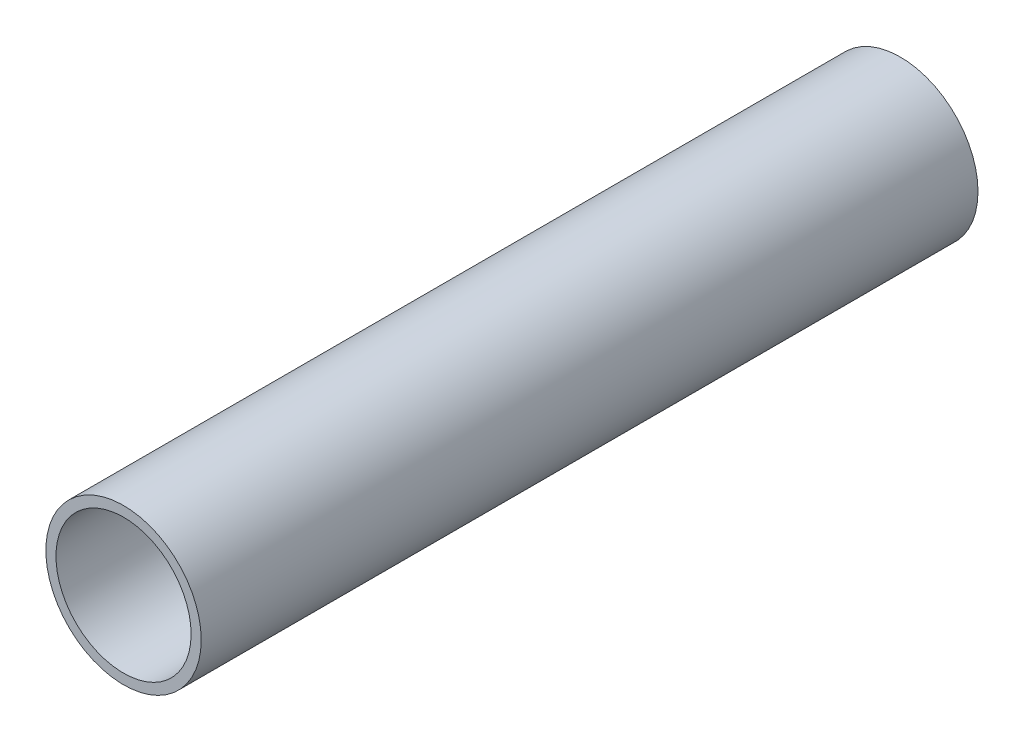
ISO-10303-21;
HEADER;
FILE_DESCRIPTION(('STEP AP214'),'2;1');
FILE_NAME('part.step','',(''),(''),'','','');
FILE_SCHEMA(('AUTOMOTIVE_DESIGN { 1 0 10303 214 1 1 1 1 }'));
ENDSEC;
DATA;
#1=APPLICATION_CONTEXT('core data for automotive mechanical design processes');
#2=APPLICATION_PROTOCOL_DEFINITION('international standard','automotive_design',2000,#1);
#3=PRODUCT_CONTEXT('',#1,'mechanical');
#4=PRODUCT('Part','Part','',(#3));
#5=PRODUCT_RELATED_PRODUCT_CATEGORY('part','',(#4));
#6=PRODUCT_DEFINITION_FORMATION('','',#4);
#7=PRODUCT_DEFINITION_CONTEXT('part definition',#1,'design');
#8=PRODUCT_DEFINITION('design','',#6,#7);
#9=PRODUCT_DEFINITION_SHAPE('','',#8);
#10=(LENGTH_UNIT() NAMED_UNIT(*) SI_UNIT(.MILLI.,.METRE.));
#11=(NAMED_UNIT(*) PLANE_ANGLE_UNIT() SI_UNIT($,.RADIAN.));
#12=(NAMED_UNIT(*) SI_UNIT($,.STERADIAN.) SOLID_ANGLE_UNIT());
#13=UNCERTAINTY_MEASURE_WITH_UNIT(LENGTH_MEASURE(1.E-05),#10,'distance_accuracy_value','');
#14=(GEOMETRIC_REPRESENTATION_CONTEXT(3) GLOBAL_UNCERTAINTY_ASSIGNED_CONTEXT((#13)) GLOBAL_UNIT_ASSIGNED_CONTEXT((#10,
#11,#12)) REPRESENTATION_CONTEXT('',''));
#15=CARTESIAN_POINT('',(0.,0.,0.));
#16=DIRECTION('',(0.,0.,1.));
#17=DIRECTION('',(1.,0.,0.));
#18=AXIS2_PLACEMENT_3D('',#15,#16,#17);
#19=CARTESIAN_POINT('',(0.,0.,-76.2));
#20=DIRECTION('',(0.,0.,1.));
#21=DIRECTION('',(1.,0.,0.));
#22=AXIS2_PLACEMENT_3D('',#19,#20,#21);
#23=CYLINDRICAL_SURFACE('',#22,12.7);
#24=CARTESIAN_POINT('',(0.,0.,-76.2));
#25=DIRECTION('',(0.,0.,1.));
#26=DIRECTION('',(1.,0.,0.));
#27=AXIS2_PLACEMENT_3D('',#24,#25,#26);
#28=CIRCLE('',#27,12.7);
#29=CARTESIAN_POINT('',(12.7,0.,-76.2));
#30=VERTEX_POINT('',#29);
#31=EDGE_CURVE('E10',#30,#30,#28,.T.);
#32=ORIENTED_EDGE('',*,*,#31,.T.);
#33=EDGE_LOOP('',(#32));
#34=FACE_BOUND('',#33,.T.);
#35=CARTESIAN_POINT('',(0.,0.,50.8));
#36=DIRECTION('',(0.,0.,1.));
#37=DIRECTION('',(1.,0.,0.));
#38=AXIS2_PLACEMENT_3D('',#35,#36,#37);
#39=CIRCLE('',#38,12.7);
#40=CARTESIAN_POINT('',(12.7,0.,50.8));
#41=VERTEX_POINT('',#40);
#42=EDGE_CURVE('E49',#41,#41,#39,.T.);
#43=ORIENTED_EDGE('',*,*,#42,.F.);
#44=EDGE_LOOP('',(#43));
#45=FACE_BOUND('',#44,.T.);
#46=ADVANCED_FACE('F37',(#34,#45),#23,.T.);
#47=CARTESIAN_POINT('',(0.,0.,-76.2));
#48=DIRECTION('',(0.,0.,1.));
#49=DIRECTION('',(1.,0.,0.));
#50=AXIS2_PLACEMENT_3D('',#47,#48,#49);
#51=PLANE('',#50);
#52=CARTESIAN_POINT('',(0.,0.,-76.2));
#53=DIRECTION('',(0.,0.,1.));
#54=DIRECTION('',(1.,0.,0.));
#55=AXIS2_PLACEMENT_3D('',#52,#53,#54);
#56=CIRCLE('',#55,11.049);
#57=CARTESIAN_POINT('',(11.049,0.,-76.2));
#58=VERTEX_POINT('',#57);
#59=EDGE_CURVE('E44',#58,#58,#56,.T.);
#60=ORIENTED_EDGE('',*,*,#59,.T.);
#61=EDGE_LOOP('',(#60));
#62=FACE_BOUND('',#61,.T.);
#63=ORIENTED_EDGE('',*,*,#31,.F.);
#64=EDGE_LOOP('',(#63));
#65=FACE_BOUND('',#64,.T.);
#66=ADVANCED_FACE('F70',(#62,#65),#51,.F.);
#67=CARTESIAN_POINT('',(0.,0.,-76.2));
#68=DIRECTION('',(0.,0.,1.));
#69=DIRECTION('',(1.,0.,0.));
#70=AXIS2_PLACEMENT_3D('',#67,#68,#69);
#71=CYLINDRICAL_SURFACE('',#70,11.049);
#72=ORIENTED_EDGE('',*,*,#59,.F.);
#73=EDGE_LOOP('',(#72));
#74=FACE_BOUND('',#73,.T.);
#75=CARTESIAN_POINT('',(0.,0.,50.8));
#76=DIRECTION('',(0.,0.,1.));
#77=DIRECTION('',(1.,0.,0.));
#78=AXIS2_PLACEMENT_3D('',#75,#76,#77);
#79=CIRCLE('',#78,11.049);
#80=CARTESIAN_POINT('',(11.049,0.,50.8));
#81=VERTEX_POINT('',#80);
#82=EDGE_CURVE('E54',#81,#81,#79,.T.);
#83=ORIENTED_EDGE('',*,*,#82,.T.);
#84=EDGE_LOOP('',(#83));
#85=FACE_BOUND('',#84,.T.);
#86=ADVANCED_FACE('F61',(#74,#85),#71,.F.);
#87=CARTESIAN_POINT('',(0.,0.,50.8));
#88=DIRECTION('',(0.,0.,1.));
#89=DIRECTION('',(1.,0.,0.));
#90=AXIS2_PLACEMENT_3D('',#87,#88,#89);
#91=PLANE('',#90);
#92=ORIENTED_EDGE('',*,*,#42,.T.);
#93=EDGE_LOOP('',(#92));
#94=FACE_BOUND('',#93,.T.);
#95=ORIENTED_EDGE('',*,*,#82,.F.);
#96=EDGE_LOOP('',(#95));
#97=FACE_BOUND('',#96,.T.);
#98=ADVANCED_FACE('F63',(#94,#97),#91,.T.);
#99=CLOSED_SHELL('',(#46,#66,#86,#98));
#100=MANIFOLD_SOLID_BREP('B2',#99);
#101=ADVANCED_BREP_SHAPE_REPRESENTATION('',(#18,#100),#14);
#102=SHAPE_DEFINITION_REPRESENTATION(#9,#101);
ENDSEC;
END-ISO-10303-21;
